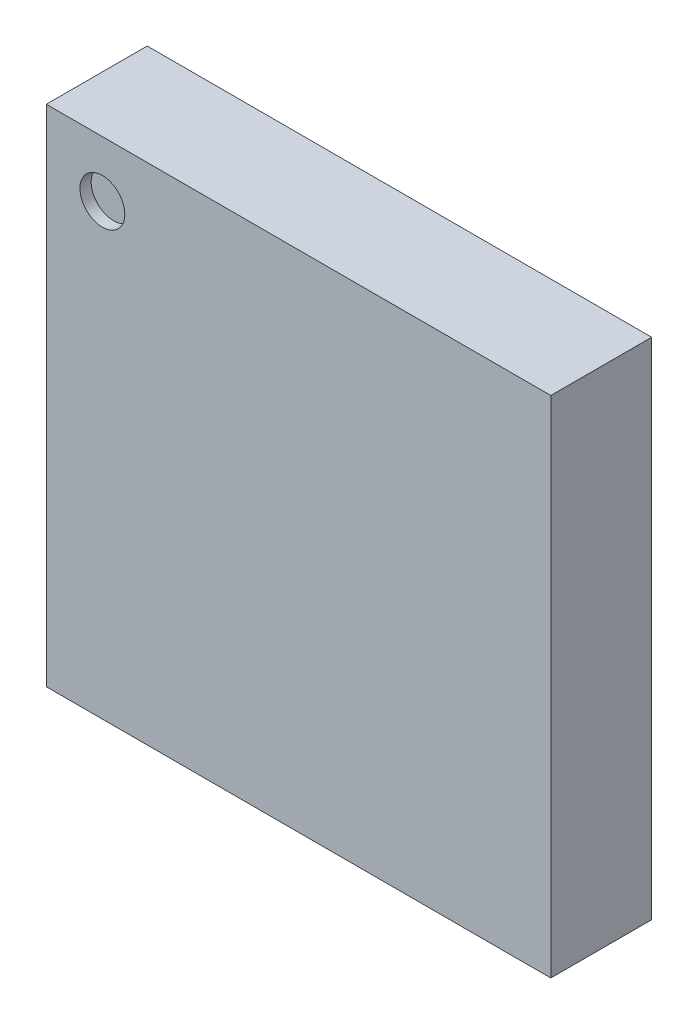
ISO-10303-21;
HEADER;
FILE_DESCRIPTION(('STEP AP214'),'2;1');
FILE_NAME('part.step','',(''),(''),'','','');
FILE_SCHEMA(('AUTOMOTIVE_DESIGN { 1 0 10303 214 1 1 1 1 }'));
ENDSEC;
DATA;
#1=APPLICATION_CONTEXT('core data for automotive mechanical design processes');
#2=APPLICATION_PROTOCOL_DEFINITION('international standard','automotive_design',2000,#1);
#3=PRODUCT_CONTEXT('',#1,'mechanical');
#4=PRODUCT('Part','Part','',(#3));
#5=PRODUCT_RELATED_PRODUCT_CATEGORY('part','',(#4));
#6=PRODUCT_DEFINITION_FORMATION('','',#4);
#7=PRODUCT_DEFINITION_CONTEXT('part definition',#1,'design');
#8=PRODUCT_DEFINITION('design','',#6,#7);
#9=PRODUCT_DEFINITION_SHAPE('','',#8);
#10=(LENGTH_UNIT() NAMED_UNIT(*) SI_UNIT(.MILLI.,.METRE.));
#11=(NAMED_UNIT(*) PLANE_ANGLE_UNIT() SI_UNIT($,.RADIAN.));
#12=(NAMED_UNIT(*) SI_UNIT($,.STERADIAN.) SOLID_ANGLE_UNIT());
#13=UNCERTAINTY_MEASURE_WITH_UNIT(LENGTH_MEASURE(1.E-05),#10,'distance_accuracy_value','');
#14=(GEOMETRIC_REPRESENTATION_CONTEXT(3) GLOBAL_UNCERTAINTY_ASSIGNED_CONTEXT((#13)) GLOBAL_UNIT_ASSIGNED_CONTEXT((#10,
#11,#12)) REPRESENTATION_CONTEXT('',''));
#15=CARTESIAN_POINT('',(0.,0.,0.));
#16=DIRECTION('',(0.,0.,1.));
#17=DIRECTION('',(1.,0.,0.));
#18=AXIS2_PLACEMENT_3D('',#15,#16,#17);
#19=CARTESIAN_POINT('',(-1.75,1.75,0.8));
#20=DIRECTION('',(0.,0.,1.));
#21=DIRECTION('',(1.,0.,0.));
#22=AXIS2_PLACEMENT_3D('',#19,#20,#21);
#23=PLANE('',#22);
#24=CARTESIAN_POINT('',(-1.75,1.75,0.8));
#25=DIRECTION('',(0.,0.,1.));
#26=DIRECTION('',(1.,0.,0.));
#27=AXIS2_PLACEMENT_3D('',#24,#25,#26);
#28=CIRCLE('',#27,0.2);
#29=CARTESIAN_POINT('',(-1.55,1.75,0.8));
#30=VERTEX_POINT('',#29);
#31=EDGE_CURVE('E20',#30,#30,#28,.T.);
#32=ORIENTED_EDGE('',*,*,#31,.T.);
#33=EDGE_LOOP('',(#32));
#34=FACE_BOUND('',#33,.T.);
#35=ADVANCED_FACE('F17',(#34),#23,.T.);
#36=CARTESIAN_POINT('',(-1.75,1.75,0.9));
#37=DIRECTION('',(0.,0.,1.));
#38=DIRECTION('',(1.,0.,0.));
#39=AXIS2_PLACEMENT_3D('',#36,#37,#38);
#40=CYLINDRICAL_SURFACE('',#39,0.2);
#41=ORIENTED_EDGE('',*,*,#31,.F.);
#42=EDGE_LOOP('',(#41));
#43=FACE_BOUND('',#42,.T.);
#44=CARTESIAN_POINT('',(-1.75,1.75,0.9));
#45=DIRECTION('',(0.,0.,1.));
#46=DIRECTION('',(1.,0.,0.));
#47=AXIS2_PLACEMENT_3D('',#44,#45,#46);
#48=CIRCLE('',#47,0.2);
#49=CARTESIAN_POINT('',(-1.55,1.75,0.9));
#50=VERTEX_POINT('',#49);
#51=EDGE_CURVE('E75',#50,#50,#48,.F.);
#52=ORIENTED_EDGE('',*,*,#51,.F.);
#53=EDGE_LOOP('',(#52));
#54=FACE_BOUND('',#53,.T.);
#55=ADVANCED_FACE('F90',(#43,#54),#40,.F.);
#56=CARTESIAN_POINT('',(0.,0.,0.9));
#57=DIRECTION('',(0.,0.,1.));
#58=DIRECTION('',(1.,0.,0.));
#59=AXIS2_PLACEMENT_3D('',#56,#57,#58);
#60=PLANE('',#59);
#61=ORIENTED_EDGE('',*,*,#51,.T.);
#62=EDGE_LOOP('',(#61));
#63=FACE_BOUND('',#62,.T.);
#64=DIRECTION('',(1.,0.,0.));
#65=VECTOR('',#64,1.);
#66=CARTESIAN_POINT('',(2.25,-2.25,0.9));
#67=LINE('',#66,#65);
#68=CARTESIAN_POINT('',(2.25,-2.25,0.9));
#69=VERTEX_POINT('',#68);
#70=CARTESIAN_POINT('',(-2.25,-2.25,0.9));
#71=VERTEX_POINT('',#70);
#72=EDGE_CURVE('E58',#69,#71,#67,.F.);
#73=ORIENTED_EDGE('',*,*,#72,.F.);
#74=DIRECTION('',(0.,1.,0.));
#75=VECTOR('',#74,1.);
#76=CARTESIAN_POINT('',(2.25,2.25,0.9));
#77=LINE('',#76,#75);
#78=CARTESIAN_POINT('',(2.25,2.25,0.9));
#79=VERTEX_POINT('',#78);
#80=EDGE_CURVE('E53',#79,#69,#77,.F.);
#81=ORIENTED_EDGE('',*,*,#80,.F.);
#82=DIRECTION('',(1.,0.,0.));
#83=VECTOR('',#82,1.);
#84=CARTESIAN_POINT('',(-2.25,2.25,0.9));
#85=LINE('',#84,#83);
#86=CARTESIAN_POINT('',(-2.25,2.25,0.9));
#87=VERTEX_POINT('',#86);
#88=EDGE_CURVE('E71',#87,#79,#85,.T.);
#89=ORIENTED_EDGE('',*,*,#88,.F.);
#90=DIRECTION('',(0.,1.,0.));
#91=VECTOR('',#90,1.);
#92=CARTESIAN_POINT('',(-2.25,-2.25,0.9));
#93=LINE('',#92,#91);
#94=EDGE_CURVE('E67',#71,#87,#93,.T.);
#95=ORIENTED_EDGE('',*,*,#94,.F.);
#96=EDGE_LOOP('',(#73,#81,#89,#95));
#97=FACE_BOUND('',#96,.T.);
#98=ADVANCED_FACE('F70',(#63,#97),#60,.T.);
#99=CARTESIAN_POINT('',(-2.25,-2.25,0.));
#100=DIRECTION('',(-1.,0.,0.));
#101=DIRECTION('',(0.,0.,1.));
#102=AXIS2_PLACEMENT_3D('',#99,#100,#101);
#103=PLANE('',#102);
#104=DIRECTION('',(0.,0.,1.));
#105=VECTOR('',#104,1.);
#106=CARTESIAN_POINT('',(-2.25,2.25,0.));
#107=LINE('',#106,#105);
#108=CARTESIAN_POINT('',(-2.25,2.25,0.));
#109=VERTEX_POINT('',#108);
#110=EDGE_CURVE('E168',#109,#87,#107,.T.);
#111=ORIENTED_EDGE('',*,*,#110,.F.);
#112=DIRECTION('',(0.,1.,0.));
#113=VECTOR('',#112,1.);
#114=CARTESIAN_POINT('',(-2.25,0.,0.));
#115=LINE('',#114,#113);
#116=CARTESIAN_POINT('',(-2.25,-2.25,0.));
#117=VERTEX_POINT('',#116);
#118=EDGE_CURVE('E79',#109,#117,#115,.F.);
#119=ORIENTED_EDGE('',*,*,#118,.T.);
#120=DIRECTION('',(0.,0.,-1.));
#121=VECTOR('',#120,1.);
#122=CARTESIAN_POINT('',(-2.25,-2.25,0.));
#123=LINE('',#122,#121);
#124=EDGE_CURVE('E63',#71,#117,#123,.T.);
#125=ORIENTED_EDGE('',*,*,#124,.F.);
#126=ORIENTED_EDGE('',*,*,#94,.T.);
#127=EDGE_LOOP('',(#111,#119,#125,#126));
#128=FACE_BOUND('',#127,.T.);
#129=ADVANCED_FACE('F78',(#128),#103,.T.);
#130=CARTESIAN_POINT('',(2.25,-2.25,0.));
#131=DIRECTION('',(0.,-1.,0.));
#132=DIRECTION('',(0.,0.,-1.));
#133=AXIS2_PLACEMENT_3D('',#130,#131,#132);
#134=PLANE('',#133);
#135=ORIENTED_EDGE('',*,*,#124,.T.);
#136=DIRECTION('',(1.,0.,0.));
#137=VECTOR('',#136,1.);
#138=CARTESIAN_POINT('',(0.,-2.25,0.));
#139=LINE('',#138,#137);
#140=CARTESIAN_POINT('',(2.25,-2.25,0.));
#141=VERTEX_POINT('',#140);
#142=EDGE_CURVE('E169',#117,#141,#139,.T.);
#143=ORIENTED_EDGE('',*,*,#142,.T.);
#144=DIRECTION('',(0.,0.,-1.));
#145=VECTOR('',#144,1.);
#146=CARTESIAN_POINT('',(2.25,-2.25,0.));
#147=LINE('',#146,#145);
#148=EDGE_CURVE('E65',#69,#141,#147,.T.);
#149=ORIENTED_EDGE('',*,*,#148,.F.);
#150=ORIENTED_EDGE('',*,*,#72,.T.);
#151=EDGE_LOOP('',(#135,#143,#149,#150));
#152=FACE_BOUND('',#151,.T.);
#153=ADVANCED_FACE('F60',(#152),#134,.T.);
#154=CARTESIAN_POINT('',(2.25,2.25,0.));
#155=DIRECTION('',(1.,0.,0.));
#156=DIRECTION('',(0.,0.,-1.));
#157=AXIS2_PLACEMENT_3D('',#154,#155,#156);
#158=PLANE('',#157);
#159=ORIENTED_EDGE('',*,*,#148,.T.);
#160=DIRECTION('',(0.,1.,0.));
#161=VECTOR('',#160,1.);
#162=CARTESIAN_POINT('',(2.25,0.,0.));
#163=LINE('',#162,#161);
#164=CARTESIAN_POINT('',(2.25,2.25,0.));
#165=VERTEX_POINT('',#164);
#166=EDGE_CURVE('E26',#141,#165,#163,.T.);
#167=ORIENTED_EDGE('',*,*,#166,.T.);
#168=DIRECTION('',(0.,0.,1.));
#169=VECTOR('',#168,1.);
#170=CARTESIAN_POINT('',(2.25,2.25,0.));
#171=LINE('',#170,#169);
#172=EDGE_CURVE('E34',#79,#165,#171,.F.);
#173=ORIENTED_EDGE('',*,*,#172,.F.);
#174=ORIENTED_EDGE('',*,*,#80,.T.);
#175=EDGE_LOOP('',(#159,#167,#173,#174));
#176=FACE_BOUND('',#175,.T.);
#177=ADVANCED_FACE('F107',(#176),#158,.T.);
#178=CARTESIAN_POINT('',(-2.25,2.25,0.));
#179=DIRECTION('',(0.,1.,0.));
#180=DIRECTION('',(0.,0.,1.));
#181=AXIS2_PLACEMENT_3D('',#178,#179,#180);
#182=PLANE('',#181);
#183=ORIENTED_EDGE('',*,*,#172,.T.);
#184=DIRECTION('',(1.,0.,0.));
#185=VECTOR('',#184,1.);
#186=CARTESIAN_POINT('',(0.,2.25,0.));
#187=LINE('',#186,#185);
#188=EDGE_CURVE('E11',#165,#109,#187,.F.);
#189=ORIENTED_EDGE('',*,*,#188,.T.);
#190=ORIENTED_EDGE('',*,*,#110,.T.);
#191=ORIENTED_EDGE('',*,*,#88,.T.);
#192=EDGE_LOOP('',(#183,#189,#190,#191));
#193=FACE_BOUND('',#192,.T.);
#194=ADVANCED_FACE('F101',(#193),#182,.T.);
#195=CARTESIAN_POINT('',(0.,0.,0.));
#196=DIRECTION('',(0.,0.,1.));
#197=DIRECTION('',(1.,0.,0.));
#198=AXIS2_PLACEMENT_3D('',#195,#196,#197);
#199=PLANE('',#198);
#200=ORIENTED_EDGE('',*,*,#166,.F.);
#201=ORIENTED_EDGE('',*,*,#142,.F.);
#202=ORIENTED_EDGE('',*,*,#118,.F.);
#203=ORIENTED_EDGE('',*,*,#188,.F.);
#204=EDGE_LOOP('',(#200,#201,#202,#203));
#205=FACE_BOUND('',#204,.T.);
#206=ADVANCED_FACE('F99',(#205),#199,.F.);
#207=CLOSED_SHELL('',(#35,#55,#98,#129,#153,#177,#194,#206));
#208=MANIFOLD_SOLID_BREP('B1',#207);
#209=ADVANCED_BREP_SHAPE_REPRESENTATION('',(#18,#208),#14);
#210=SHAPE_DEFINITION_REPRESENTATION(#9,#209);
ENDSEC;
END-ISO-10303-21;
